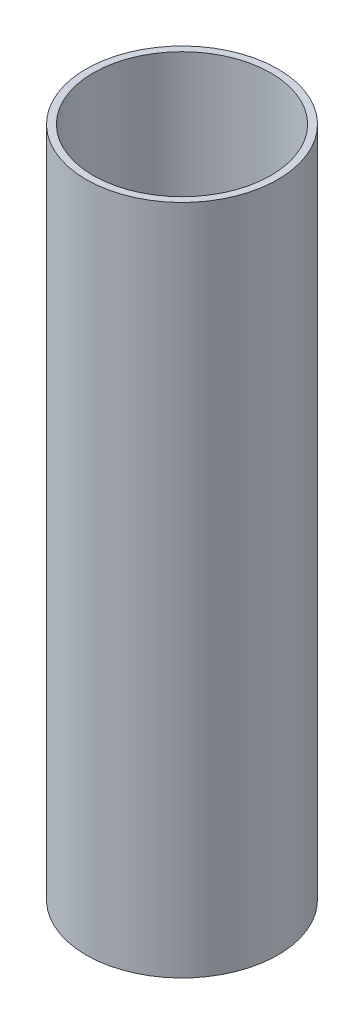
ISO-10303-21;
HEADER;
FILE_DESCRIPTION(('STEP AP214'),'2;1');
FILE_NAME('part.step','',(''),(''),'','','');
FILE_SCHEMA(('AUTOMOTIVE_DESIGN { 1 0 10303 214 1 1 1 1 }'));
ENDSEC;
DATA;
#1=APPLICATION_CONTEXT('core data for automotive mechanical design processes');
#2=APPLICATION_PROTOCOL_DEFINITION('international standard','automotive_design',2000,#1);
#3=PRODUCT_CONTEXT('',#1,'mechanical');
#4=PRODUCT('Part','Part','',(#3));
#5=PRODUCT_RELATED_PRODUCT_CATEGORY('part','',(#4));
#6=PRODUCT_DEFINITION_FORMATION('','',#4);
#7=PRODUCT_DEFINITION_CONTEXT('part definition',#1,'design');
#8=PRODUCT_DEFINITION('design','',#6,#7);
#9=PRODUCT_DEFINITION_SHAPE('','',#8);
#10=(LENGTH_UNIT() NAMED_UNIT(*) SI_UNIT(.MILLI.,.METRE.));
#11=(NAMED_UNIT(*) PLANE_ANGLE_UNIT() SI_UNIT($,.RADIAN.));
#12=(NAMED_UNIT(*) SI_UNIT($,.STERADIAN.) SOLID_ANGLE_UNIT());
#13=UNCERTAINTY_MEASURE_WITH_UNIT(LENGTH_MEASURE(1.E-05),#10,'distance_accuracy_value','');
#14=(GEOMETRIC_REPRESENTATION_CONTEXT(3) GLOBAL_UNCERTAINTY_ASSIGNED_CONTEXT((#13)) GLOBAL_UNIT_ASSIGNED_CONTEXT((#10,
#11,#12)) REPRESENTATION_CONTEXT('',''));
#15=CARTESIAN_POINT('',(0.,0.,0.));
#16=DIRECTION('',(0.,0.,1.));
#17=DIRECTION('',(1.,0.,0.));
#18=AXIS2_PLACEMENT_3D('',#15,#16,#17);
#19=CARTESIAN_POINT('',(0.,177.66,0.));
#20=DIRECTION('',(0.,1.,0.));
#21=DIRECTION('',(0.,0.,1.));
#22=AXIS2_PLACEMENT_3D('',#19,#20,#21);
#23=PLANE('',#22);
#24=CARTESIAN_POINT('',(0.,177.66,0.));
#25=DIRECTION('',(0.,1.,0.));
#26=DIRECTION('',(0.,0.,1.));
#27=AXIS2_PLACEMENT_3D('',#24,#25,#26);
#28=CIRCLE('',#27,25.35);
#29=CARTESIAN_POINT('',(0.,177.66,25.35));
#30=VERTEX_POINT('',#29);
#31=EDGE_CURVE('E10',#30,#30,#28,.T.);
#32=ORIENTED_EDGE('',*,*,#31,.T.);
#33=EDGE_LOOP('',(#32));
#34=FACE_BOUND('',#33,.T.);
#35=CARTESIAN_POINT('',(0.,177.66,0.));
#36=DIRECTION('',(0.,1.,0.));
#37=DIRECTION('',(0.,0.,1.));
#38=AXIS2_PLACEMENT_3D('',#35,#36,#37);
#39=CIRCLE('',#38,23.5);
#40=CARTESIAN_POINT('',(0.,177.66,23.5));
#41=VERTEX_POINT('',#40);
#42=EDGE_CURVE('E45',#41,#41,#39,.T.);
#43=ORIENTED_EDGE('',*,*,#42,.F.);
#44=EDGE_LOOP('',(#43));
#45=FACE_BOUND('',#44,.T.);
#46=ADVANCED_FACE('F34',(#34,#45),#23,.T.);
#47=CARTESIAN_POINT('',(0.,0.,0.));
#48=DIRECTION('',(0.,1.,0.));
#49=DIRECTION('',(0.,0.,1.));
#50=AXIS2_PLACEMENT_3D('',#47,#48,#49);
#51=PLANE('',#50);
#52=CARTESIAN_POINT('',(0.,0.,0.));
#53=DIRECTION('',(0.,1.,0.));
#54=DIRECTION('',(0.,0.,1.));
#55=AXIS2_PLACEMENT_3D('',#52,#53,#54);
#56=CIRCLE('',#55,25.35);
#57=CARTESIAN_POINT('',(0.,0.,25.35));
#58=VERTEX_POINT('',#57);
#59=EDGE_CURVE('E38',#58,#58,#56,.T.);
#60=ORIENTED_EDGE('',*,*,#59,.F.);
#61=EDGE_LOOP('',(#60));
#62=FACE_BOUND('',#61,.T.);
#63=CARTESIAN_POINT('',(0.,0.,0.));
#64=DIRECTION('',(0.,1.,0.));
#65=DIRECTION('',(0.,0.,1.));
#66=AXIS2_PLACEMENT_3D('',#63,#64,#65);
#67=CIRCLE('',#66,23.5);
#68=CARTESIAN_POINT('',(0.,0.,23.5));
#69=VERTEX_POINT('',#68);
#70=EDGE_CURVE('E47',#69,#69,#67,.T.);
#71=ORIENTED_EDGE('',*,*,#70,.T.);
#72=EDGE_LOOP('',(#71));
#73=FACE_BOUND('',#72,.T.);
#74=ADVANCED_FACE('F57',(#62,#73),#51,.F.);
#75=CARTESIAN_POINT('',(0.,177.66,0.));
#76=DIRECTION('',(0.,-1.,0.));
#77=DIRECTION('',(0.,0.,-1.));
#78=AXIS2_PLACEMENT_3D('',#75,#76,#77);
#79=CYLINDRICAL_SURFACE('',#78,25.35);
#80=ORIENTED_EDGE('',*,*,#31,.F.);
#81=EDGE_LOOP('',(#80));
#82=FACE_BOUND('',#81,.T.);
#83=ORIENTED_EDGE('',*,*,#59,.T.);
#84=EDGE_LOOP('',(#83));
#85=FACE_BOUND('',#84,.T.);
#86=ADVANCED_FACE('F36',(#82,#85),#79,.T.);
#87=CARTESIAN_POINT('',(0.,177.66,0.));
#88=DIRECTION('',(0.,-1.,0.));
#89=DIRECTION('',(0.,0.,-1.));
#90=AXIS2_PLACEMENT_3D('',#87,#88,#89);
#91=CYLINDRICAL_SURFACE('',#90,23.5);
#92=ORIENTED_EDGE('',*,*,#42,.T.);
#93=EDGE_LOOP('',(#92));
#94=FACE_BOUND('',#93,.T.);
#95=ORIENTED_EDGE('',*,*,#70,.F.);
#96=EDGE_LOOP('',(#95));
#97=FACE_BOUND('',#96,.T.);
#98=ADVANCED_FACE('F53',(#94,#97),#91,.F.);
#99=CLOSED_SHELL('',(#46,#74,#86,#98));
#100=MANIFOLD_SOLID_BREP('B2',#99);
#101=ADVANCED_BREP_SHAPE_REPRESENTATION('',(#18,#100),#14);
#102=SHAPE_DEFINITION_REPRESENTATION(#9,#101);
ENDSEC;
END-ISO-10303-21;
